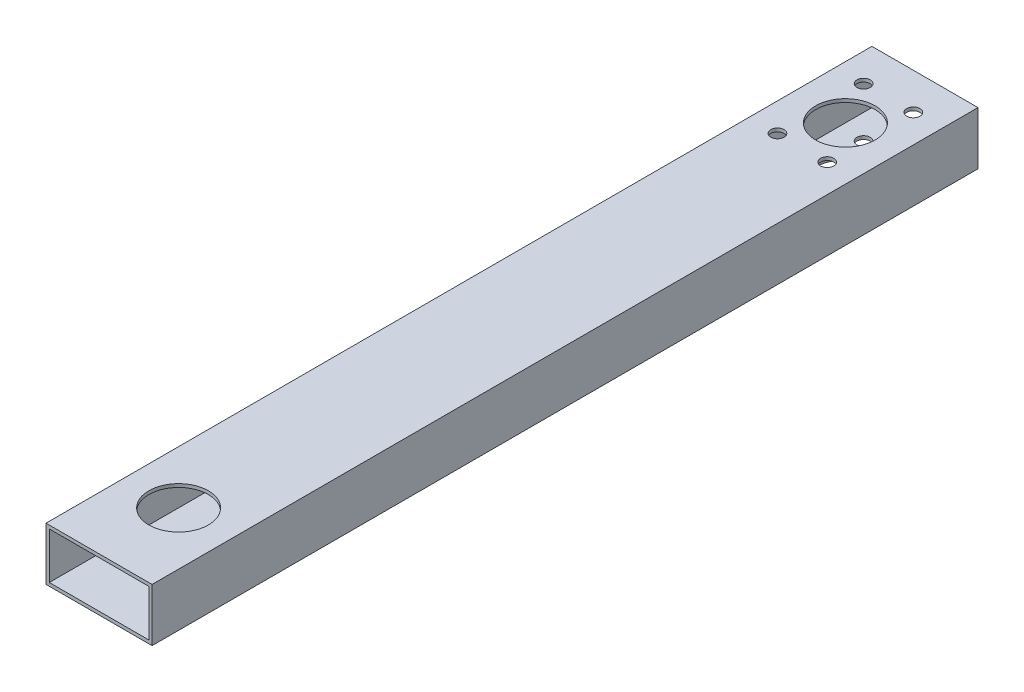
ISO-10303-21;
HEADER;
FILE_DESCRIPTION(('STEP AP214'),'2;1');
FILE_NAME('part.step','',(''),(''),'','','');
FILE_SCHEMA(('AUTOMOTIVE_DESIGN { 1 0 10303 214 1 1 1 1 }'));
ENDSEC;
DATA;
#1=APPLICATION_CONTEXT('core data for automotive mechanical design processes');
#2=APPLICATION_PROTOCOL_DEFINITION('international standard','automotive_design',2000,#1);
#3=PRODUCT_CONTEXT('',#1,'mechanical');
#4=PRODUCT('Part','Part','',(#3));
#5=PRODUCT_RELATED_PRODUCT_CATEGORY('part','',(#4));
#6=PRODUCT_DEFINITION_FORMATION('','',#4);
#7=PRODUCT_DEFINITION_CONTEXT('part definition',#1,'design');
#8=PRODUCT_DEFINITION('design','',#6,#7);
#9=PRODUCT_DEFINITION_SHAPE('','',#8);
#10=(LENGTH_UNIT() NAMED_UNIT(*) SI_UNIT(.MILLI.,.METRE.));
#11=(NAMED_UNIT(*) PLANE_ANGLE_UNIT() SI_UNIT($,.RADIAN.));
#12=(NAMED_UNIT(*) SI_UNIT($,.STERADIAN.) SOLID_ANGLE_UNIT());
#13=UNCERTAINTY_MEASURE_WITH_UNIT(LENGTH_MEASURE(1.E-05),#10,'distance_accuracy_value','');
#14=(GEOMETRIC_REPRESENTATION_CONTEXT(3) GLOBAL_UNCERTAINTY_ASSIGNED_CONTEXT((#13)) GLOBAL_UNIT_ASSIGNED_CONTEXT((#10,
#11,#12)) REPRESENTATION_CONTEXT('',''));
#15=CARTESIAN_POINT('',(0.,0.,0.));
#16=DIRECTION('',(0.,0.,1.));
#17=DIRECTION('',(1.,0.,0.));
#18=AXIS2_PLACEMENT_3D('',#15,#16,#17);
#19=CARTESIAN_POINT('',(0.,0.,395.478));
#20=DIRECTION('',(0.,0.,-1.));
#21=DIRECTION('',(-1.,0.,0.));
#22=AXIS2_PLACEMENT_3D('',#19,#20,#21);
#23=PLANE('',#22);
#24=DIRECTION('',(0.,-1.,0.));
#25=VECTOR('',#24,1.);
#26=CARTESIAN_POINT('',(0.,0.,395.478));
#27=LINE('',#26,#25);
#28=CARTESIAN_POINT('',(0.,25.4,395.478));
#29=VERTEX_POINT('',#28);
#30=CARTESIAN_POINT('',(0.,0.,395.478));
#31=VERTEX_POINT('',#30);
#32=EDGE_CURVE('E148',#29,#31,#27,.T.);
#33=ORIENTED_EDGE('',*,*,#32,.T.);
#34=DIRECTION('',(1.,0.,0.));
#35=VECTOR('',#34,1.);
#36=CARTESIAN_POINT('',(0.,0.,395.478));
#37=LINE('',#36,#35);
#38=CARTESIAN_POINT('',(50.8,0.,395.478));
#39=VERTEX_POINT('',#38);
#40=EDGE_CURVE('E151',#31,#39,#37,.T.);
#41=ORIENTED_EDGE('',*,*,#40,.T.);
#42=DIRECTION('',(0.,1.,0.));
#43=VECTOR('',#42,1.);
#44=CARTESIAN_POINT('',(50.8,0.,395.478));
#45=LINE('',#44,#43);
#46=CARTESIAN_POINT('',(50.8,25.4,395.478));
#47=VERTEX_POINT('',#46);
#48=EDGE_CURVE('E154',#39,#47,#45,.T.);
#49=ORIENTED_EDGE('',*,*,#48,.T.);
#50=DIRECTION('',(-1.,0.,0.));
#51=VECTOR('',#50,1.);
#52=CARTESIAN_POINT('',(0.,25.4,395.478));
#53=LINE('',#52,#51);
#54=EDGE_CURVE('E156',#47,#29,#53,.T.);
#55=ORIENTED_EDGE('',*,*,#54,.T.);
#56=EDGE_LOOP('',(#33,#41,#49,#55));
#57=FACE_BOUND('',#56,.T.);
#58=DIRECTION('',(0.,-1.,0.));
#59=VECTOR('',#58,1.);
#60=CARTESIAN_POINT('',(1.5875,1.5875,395.478));
#61=LINE('',#60,#59);
#62=CARTESIAN_POINT('',(1.5875,23.8125,395.478));
#63=VERTEX_POINT('',#62);
#64=CARTESIAN_POINT('',(1.5875,1.5875,395.478));
#65=VERTEX_POINT('',#64);
#66=EDGE_CURVE('E110',#63,#65,#61,.T.);
#67=ORIENTED_EDGE('',*,*,#66,.F.);
#68=DIRECTION('',(-1.,0.,0.));
#69=VECTOR('',#68,1.);
#70=CARTESIAN_POINT('',(1.5875,23.8125,395.478));
#71=LINE('',#70,#69);
#72=CARTESIAN_POINT('',(49.2125,23.8125,395.478));
#73=VERTEX_POINT('',#72);
#74=EDGE_CURVE('E132',#73,#63,#71,.T.);
#75=ORIENTED_EDGE('',*,*,#74,.F.);
#76=DIRECTION('',(0.,1.,0.));
#77=VECTOR('',#76,1.);
#78=CARTESIAN_POINT('',(49.2125,1.5875,395.478));
#79=LINE('',#78,#77);
#80=CARTESIAN_POINT('',(49.2125,1.5875,395.478));
#81=VERTEX_POINT('',#80);
#82=EDGE_CURVE('E130',#81,#73,#79,.T.);
#83=ORIENTED_EDGE('',*,*,#82,.F.);
#84=DIRECTION('',(1.,0.,0.));
#85=VECTOR('',#84,1.);
#86=CARTESIAN_POINT('',(1.5875,1.5875,395.478));
#87=LINE('',#86,#85);
#88=EDGE_CURVE('E118',#65,#81,#87,.T.);
#89=ORIENTED_EDGE('',*,*,#88,.F.);
#90=EDGE_LOOP('',(#67,#75,#83,#89));
#91=FACE_BOUND('',#90,.T.);
#92=ADVANCED_FACE('F43',(#57,#91),#23,.F.);
#93=CARTESIAN_POINT('',(0.,0.,0.));
#94=DIRECTION('',(0.,0.,-1.));
#95=DIRECTION('',(-1.,0.,0.));
#96=AXIS2_PLACEMENT_3D('',#93,#94,#95);
#97=PLANE('',#96);
#98=DIRECTION('',(0.,-1.,0.));
#99=VECTOR('',#98,1.);
#100=CARTESIAN_POINT('',(0.,0.,0.));
#101=LINE('',#100,#99);
#102=CARTESIAN_POINT('',(0.,25.4,0.));
#103=VERTEX_POINT('',#102);
#104=CARTESIAN_POINT('',(0.,0.,0.));
#105=VERTEX_POINT('',#104);
#106=EDGE_CURVE('E126',#103,#105,#101,.T.);
#107=ORIENTED_EDGE('',*,*,#106,.F.);
#108=DIRECTION('',(-1.,0.,0.));
#109=VECTOR('',#108,1.);
#110=CARTESIAN_POINT('',(0.,25.4,0.));
#111=LINE('',#110,#109);
#112=CARTESIAN_POINT('',(50.8,25.4,0.));
#113=VERTEX_POINT('',#112);
#114=EDGE_CURVE('E152',#113,#103,#111,.T.);
#115=ORIENTED_EDGE('',*,*,#114,.F.);
#116=DIRECTION('',(0.,1.,0.));
#117=VECTOR('',#116,1.);
#118=CARTESIAN_POINT('',(50.8,0.,0.));
#119=LINE('',#118,#117);
#120=CARTESIAN_POINT('',(50.8,0.,0.));
#121=VERTEX_POINT('',#120);
#122=EDGE_CURVE('E163',#121,#113,#119,.T.);
#123=ORIENTED_EDGE('',*,*,#122,.F.);
#124=DIRECTION('',(1.,0.,0.));
#125=VECTOR('',#124,1.);
#126=CARTESIAN_POINT('',(0.,0.,0.));
#127=LINE('',#126,#125);
#128=EDGE_CURVE('E161',#105,#121,#127,.T.);
#129=ORIENTED_EDGE('',*,*,#128,.F.);
#130=EDGE_LOOP('',(#107,#115,#123,#129));
#131=FACE_BOUND('',#130,.T.);
#132=DIRECTION('',(-1.,0.,0.));
#133=VECTOR('',#132,1.);
#134=CARTESIAN_POINT('',(1.5875,23.8125,0.));
#135=LINE('',#134,#133);
#136=CARTESIAN_POINT('',(49.2125,23.8125,0.));
#137=VERTEX_POINT('',#136);
#138=CARTESIAN_POINT('',(1.5875,23.8125,0.));
#139=VERTEX_POINT('',#138);
#140=EDGE_CURVE('E119',#137,#139,#135,.T.);
#141=ORIENTED_EDGE('',*,*,#140,.T.);
#142=DIRECTION('',(0.,-1.,0.));
#143=VECTOR('',#142,1.);
#144=CARTESIAN_POINT('',(1.5875,1.5875,0.));
#145=LINE('',#144,#143);
#146=CARTESIAN_POINT('',(1.5875,1.5875,0.));
#147=VERTEX_POINT('',#146);
#148=EDGE_CURVE('E68',#139,#147,#145,.T.);
#149=ORIENTED_EDGE('',*,*,#148,.T.);
#150=DIRECTION('',(1.,0.,0.));
#151=VECTOR('',#150,1.);
#152=CARTESIAN_POINT('',(1.5875,1.5875,0.));
#153=LINE('',#152,#151);
#154=CARTESIAN_POINT('',(49.2125,1.5875,0.));
#155=VERTEX_POINT('',#154);
#156=EDGE_CURVE('E125',#147,#155,#153,.T.);
#157=ORIENTED_EDGE('',*,*,#156,.T.);
#158=DIRECTION('',(0.,1.,0.));
#159=VECTOR('',#158,1.);
#160=CARTESIAN_POINT('',(49.2125,1.5875,0.));
#161=LINE('',#160,#159);
#162=EDGE_CURVE('E140',#155,#137,#161,.T.);
#163=ORIENTED_EDGE('',*,*,#162,.T.);
#164=EDGE_LOOP('',(#141,#149,#157,#163));
#165=FACE_BOUND('',#164,.T.);
#166=ADVANCED_FACE('F241',(#131,#165),#97,.T.);
#167=CARTESIAN_POINT('',(0.,0.,395.478));
#168=DIRECTION('',(1.,0.,0.));
#169=DIRECTION('',(0.,0.,-1.));
#170=AXIS2_PLACEMENT_3D('',#167,#168,#169);
#171=PLANE('',#170);
#172=ORIENTED_EDGE('',*,*,#106,.T.);
#173=DIRECTION('',(0.,0.,-1.));
#174=VECTOR('',#173,1.);
#175=CARTESIAN_POINT('',(0.,0.,395.478));
#176=LINE('',#175,#174);
#177=EDGE_CURVE('E11',#31,#105,#176,.T.);
#178=ORIENTED_EDGE('',*,*,#177,.F.);
#179=ORIENTED_EDGE('',*,*,#32,.F.);
#180=DIRECTION('',(0.,0.,-1.));
#181=VECTOR('',#180,1.);
#182=CARTESIAN_POINT('',(0.,25.4,395.478));
#183=LINE('',#182,#181);
#184=EDGE_CURVE('E158',#29,#103,#183,.T.);
#185=ORIENTED_EDGE('',*,*,#184,.T.);
#186=EDGE_LOOP('',(#172,#178,#179,#185));
#187=FACE_BOUND('',#186,.T.);
#188=ADVANCED_FACE('F45',(#187),#171,.F.);
#189=CARTESIAN_POINT('',(0.,0.,395.478));
#190=DIRECTION('',(0.,1.,0.));
#191=DIRECTION('',(0.,0.,1.));
#192=AXIS2_PLACEMENT_3D('',#189,#190,#191);
#193=PLANE('',#192);
#194=CARTESIAN_POINT('',(25.4,0.,357.378));
#195=DIRECTION('',(0.,1.,0.));
#196=DIRECTION('',(0.,0.,1.));
#197=AXIS2_PLACEMENT_3D('',#194,#195,#196);
#198=CIRCLE('',#197,14.224);
#199=CARTESIAN_POINT('',(25.4,0.,371.602));
#200=VERTEX_POINT('',#199);
#201=EDGE_CURVE('E268',#200,#200,#198,.T.);
#202=ORIENTED_EDGE('',*,*,#201,.T.);
#203=EDGE_LOOP('',(#202));
#204=FACE_BOUND('',#203,.T.);
#205=CARTESIAN_POINT('',(37.30625,0.,17.4777700723831));
#206=DIRECTION('',(0.,1.,0.));
#207=DIRECTION('',(0.,0.,-1.));
#208=AXIS2_PLACEMENT_3D('',#205,#206,#207);
#209=CIRCLE('',#208,3.175);
#210=CARTESIAN_POINT('',(37.30625,0.,14.3027700723831));
#211=VERTEX_POINT('',#210);
#212=EDGE_CURVE('E272',#211,#211,#209,.T.);
#213=ORIENTED_EDGE('',*,*,#212,.T.);
#214=EDGE_LOOP('',(#213));
#215=FACE_BOUND('',#214,.T.);
#216=CARTESIAN_POINT('',(37.3062499999999,0.,58.722229927617));
#217=DIRECTION('',(0.,1.,0.));
#218=DIRECTION('',(0.,0.,-1.));
#219=AXIS2_PLACEMENT_3D('',#216,#217,#218);
#220=CIRCLE('',#219,3.175);
#221=CARTESIAN_POINT('',(37.3062499999999,0.,55.547229927617));
#222=VERTEX_POINT('',#221);
#223=EDGE_CURVE('E276',#222,#222,#220,.T.);
#224=ORIENTED_EDGE('',*,*,#223,.T.);
#225=EDGE_LOOP('',(#224));
#226=FACE_BOUND('',#225,.T.);
#227=CARTESIAN_POINT('',(13.4937500000001,0.,58.722229927617));
#228=DIRECTION('',(0.,1.,0.));
#229=DIRECTION('',(0.,0.,1.));
#230=AXIS2_PLACEMENT_3D('',#227,#228,#229);
#231=CIRCLE('',#230,3.175);
#232=CARTESIAN_POINT('',(13.4937500000001,0.,61.897229927617));
#233=VERTEX_POINT('',#232);
#234=EDGE_CURVE('E280',#233,#233,#231,.T.);
#235=ORIENTED_EDGE('',*,*,#234,.T.);
#236=EDGE_LOOP('',(#235));
#237=FACE_BOUND('',#236,.T.);
#238=CARTESIAN_POINT('',(13.49375,0.,17.4777700723831));
#239=DIRECTION('',(0.,1.,0.));
#240=DIRECTION('',(0.,0.,1.));
#241=AXIS2_PLACEMENT_3D('',#238,#239,#240);
#242=CIRCLE('',#241,3.175);
#243=CARTESIAN_POINT('',(13.49375,0.,20.6527700723831));
#244=VERTEX_POINT('',#243);
#245=EDGE_CURVE('E284',#244,#244,#242,.T.);
#246=ORIENTED_EDGE('',*,*,#245,.T.);
#247=EDGE_LOOP('',(#246));
#248=FACE_BOUND('',#247,.T.);
#249=CARTESIAN_POINT('',(25.4,0.,38.1));
#250=DIRECTION('',(0.,1.,0.));
#251=DIRECTION('',(0.,0.,1.));
#252=AXIS2_PLACEMENT_3D('',#249,#250,#251);
#253=CIRCLE('',#252,14.224);
#254=CARTESIAN_POINT('',(25.4,0.,52.324));
#255=VERTEX_POINT('',#254);
#256=EDGE_CURVE('E177',#255,#255,#253,.T.);
#257=ORIENTED_EDGE('',*,*,#256,.T.);
#258=EDGE_LOOP('',(#257));
#259=FACE_BOUND('',#258,.T.);
#260=ORIENTED_EDGE('',*,*,#128,.T.);
#261=DIRECTION('',(0.,0.,-1.));
#262=VECTOR('',#261,1.);
#263=CARTESIAN_POINT('',(50.8,0.,395.478));
#264=LINE('',#263,#262);
#265=EDGE_CURVE('E52',#39,#121,#264,.T.);
#266=ORIENTED_EDGE('',*,*,#265,.F.);
#267=ORIENTED_EDGE('',*,*,#40,.F.);
#268=ORIENTED_EDGE('',*,*,#177,.T.);
#269=EDGE_LOOP('',(#260,#266,#267,#268));
#270=FACE_BOUND('',#269,.T.);
#271=ADVANCED_FACE('F256',(#204,#215,#226,#237,#248,#259,#270),#193,.F.);
#272=CARTESIAN_POINT('',(50.8,0.,395.478));
#273=DIRECTION('',(-1.,0.,0.));
#274=DIRECTION('',(0.,0.,1.));
#275=AXIS2_PLACEMENT_3D('',#272,#273,#274);
#276=PLANE('',#275);
#277=ORIENTED_EDGE('',*,*,#122,.T.);
#278=DIRECTION('',(0.,0.,-1.));
#279=VECTOR('',#278,1.);
#280=CARTESIAN_POINT('',(50.8,25.4,395.478));
#281=LINE('',#280,#279);
#282=EDGE_CURVE('E168',#47,#113,#281,.T.);
#283=ORIENTED_EDGE('',*,*,#282,.F.);
#284=ORIENTED_EDGE('',*,*,#48,.F.);
#285=ORIENTED_EDGE('',*,*,#265,.T.);
#286=EDGE_LOOP('',(#277,#283,#284,#285));
#287=FACE_BOUND('',#286,.T.);
#288=ADVANCED_FACE('F254',(#287),#276,.F.);
#289=CARTESIAN_POINT('',(0.,25.4,395.478));
#290=DIRECTION('',(0.,-1.,0.));
#291=DIRECTION('',(0.,0.,-1.));
#292=AXIS2_PLACEMENT_3D('',#289,#290,#291);
#293=PLANE('',#292);
#294=CARTESIAN_POINT('',(25.4,25.4,357.378));
#295=DIRECTION('',(0.,-1.,0.));
#296=DIRECTION('',(0.,0.,-1.));
#297=AXIS2_PLACEMENT_3D('',#294,#295,#296);
#298=CIRCLE('',#297,14.224);
#299=CARTESIAN_POINT('',(25.4,25.4,343.154));
#300=VERTEX_POINT('',#299);
#301=EDGE_CURVE('E138',#300,#300,#298,.T.);
#302=ORIENTED_EDGE('',*,*,#301,.T.);
#303=EDGE_LOOP('',(#302));
#304=FACE_BOUND('',#303,.T.);
#305=CARTESIAN_POINT('',(37.30625,25.4,17.4777700723831));
#306=DIRECTION('',(0.,-1.,0.));
#307=DIRECTION('',(0.,0.,-1.));
#308=AXIS2_PLACEMENT_3D('',#305,#306,#307);
#309=CIRCLE('',#308,3.175);
#310=CARTESIAN_POINT('',(37.30625,25.4,14.3027700723831));
#311=VERTEX_POINT('',#310);
#312=EDGE_CURVE('E199',#311,#311,#309,.T.);
#313=ORIENTED_EDGE('',*,*,#312,.T.);
#314=EDGE_LOOP('',(#313));
#315=FACE_BOUND('',#314,.T.);
#316=CARTESIAN_POINT('',(37.3062499999999,25.4,58.722229927617));
#317=DIRECTION('',(0.,-1.,0.));
#318=DIRECTION('',(0.,0.,-1.));
#319=AXIS2_PLACEMENT_3D('',#316,#317,#318);
#320=CIRCLE('',#319,3.175);
#321=CARTESIAN_POINT('',(37.3062499999999,25.4,55.547229927617));
#322=VERTEX_POINT('',#321);
#323=EDGE_CURVE('E195',#322,#322,#320,.T.);
#324=ORIENTED_EDGE('',*,*,#323,.T.);
#325=EDGE_LOOP('',(#324));
#326=FACE_BOUND('',#325,.T.);
#327=CARTESIAN_POINT('',(13.4937500000001,25.4,58.722229927617));
#328=DIRECTION('',(0.,-1.,0.));
#329=DIRECTION('',(0.,0.,-1.));
#330=AXIS2_PLACEMENT_3D('',#327,#328,#329);
#331=CIRCLE('',#330,3.175);
#332=CARTESIAN_POINT('',(13.4937500000001,25.4,55.547229927617));
#333=VERTEX_POINT('',#332);
#334=EDGE_CURVE('E191',#333,#333,#331,.T.);
#335=ORIENTED_EDGE('',*,*,#334,.T.);
#336=EDGE_LOOP('',(#335));
#337=FACE_BOUND('',#336,.T.);
#338=CARTESIAN_POINT('',(13.49375,25.4,17.4777700723831));
#339=DIRECTION('',(0.,-1.,0.));
#340=DIRECTION('',(0.,0.,-1.));
#341=AXIS2_PLACEMENT_3D('',#338,#339,#340);
#342=CIRCLE('',#341,3.175);
#343=CARTESIAN_POINT('',(13.49375,25.4,14.3027700723831));
#344=VERTEX_POINT('',#343);
#345=EDGE_CURVE('E187',#344,#344,#342,.T.);
#346=ORIENTED_EDGE('',*,*,#345,.T.);
#347=EDGE_LOOP('',(#346));
#348=FACE_BOUND('',#347,.T.);
#349=CARTESIAN_POINT('',(25.4,25.4,38.1));
#350=DIRECTION('',(0.,-1.,0.));
#351=DIRECTION('',(0.,0.,-1.));
#352=AXIS2_PLACEMENT_3D('',#349,#350,#351);
#353=CIRCLE('',#352,14.224);
#354=CARTESIAN_POINT('',(25.4,25.4,23.876));
#355=VERTEX_POINT('',#354);
#356=EDGE_CURVE('E182',#355,#355,#353,.T.);
#357=ORIENTED_EDGE('',*,*,#356,.T.);
#358=EDGE_LOOP('',(#357));
#359=FACE_BOUND('',#358,.T.);
#360=ORIENTED_EDGE('',*,*,#114,.T.);
#361=ORIENTED_EDGE('',*,*,#184,.F.);
#362=ORIENTED_EDGE('',*,*,#54,.F.);
#363=ORIENTED_EDGE('',*,*,#282,.T.);
#364=EDGE_LOOP('',(#360,#361,#362,#363));
#365=FACE_BOUND('',#364,.T.);
#366=ADVANCED_FACE('F216',(#304,#315,#326,#337,#348,#359,#365),#293,.F.);
#367=CARTESIAN_POINT('',(1.5875,1.5875,395.478));
#368=DIRECTION('',(1.,0.,0.));
#369=DIRECTION('',(0.,0.,-1.));
#370=AXIS2_PLACEMENT_3D('',#367,#368,#369);
#371=PLANE('',#370);
#372=ORIENTED_EDGE('',*,*,#148,.F.);
#373=DIRECTION('',(0.,0.,-1.));
#374=VECTOR('',#373,1.);
#375=CARTESIAN_POINT('',(1.5875,23.8125,395.478));
#376=LINE('',#375,#374);
#377=EDGE_CURVE('E114',#63,#139,#376,.T.);
#378=ORIENTED_EDGE('',*,*,#377,.F.);
#379=ORIENTED_EDGE('',*,*,#66,.T.);
#380=DIRECTION('',(0.,0.,-1.));
#381=VECTOR('',#380,1.);
#382=CARTESIAN_POINT('',(1.5875,1.5875,395.478));
#383=LINE('',#382,#381);
#384=EDGE_CURVE('E113',#65,#147,#383,.T.);
#385=ORIENTED_EDGE('',*,*,#384,.T.);
#386=EDGE_LOOP('',(#372,#378,#379,#385));
#387=FACE_BOUND('',#386,.T.);
#388=ADVANCED_FACE('F112',(#387),#371,.T.);
#389=CARTESIAN_POINT('',(1.5875,1.5875,395.478));
#390=DIRECTION('',(0.,1.,0.));
#391=DIRECTION('',(0.,0.,1.));
#392=AXIS2_PLACEMENT_3D('',#389,#390,#391);
#393=PLANE('',#392);
#394=CARTESIAN_POINT('',(25.4,1.5875,357.378));
#395=DIRECTION('',(0.,1.,0.));
#396=DIRECTION('',(0.,0.,1.));
#397=AXIS2_PLACEMENT_3D('',#394,#395,#396);
#398=CIRCLE('',#397,14.224);
#399=CARTESIAN_POINT('',(25.4,1.5875,371.602));
#400=VERTEX_POINT('',#399);
#401=EDGE_CURVE('E211',#400,#400,#398,.T.);
#402=ORIENTED_EDGE('',*,*,#401,.F.);
#403=EDGE_LOOP('',(#402));
#404=FACE_BOUND('',#403,.T.);
#405=CARTESIAN_POINT('',(37.30625,1.5875,17.4777700723831));
#406=DIRECTION('',(0.,1.,0.));
#407=DIRECTION('',(0.,0.,1.));
#408=AXIS2_PLACEMENT_3D('',#405,#406,#407);
#409=CIRCLE('',#408,3.175);
#410=CARTESIAN_POINT('',(37.30625,1.5875,20.6527700723831));
#411=VERTEX_POINT('',#410);
#412=EDGE_CURVE('E194',#411,#411,#409,.T.);
#413=ORIENTED_EDGE('',*,*,#412,.F.);
#414=EDGE_LOOP('',(#413));
#415=FACE_BOUND('',#414,.T.);
#416=CARTESIAN_POINT('',(37.3062499999999,1.5875,58.722229927617));
#417=DIRECTION('',(0.,1.,0.));
#418=DIRECTION('',(0.,0.,1.));
#419=AXIS2_PLACEMENT_3D('',#416,#417,#418);
#420=CIRCLE('',#419,3.175);
#421=CARTESIAN_POINT('',(37.3062499999999,1.5875,61.897229927617));
#422=VERTEX_POINT('',#421);
#423=EDGE_CURVE('E190',#422,#422,#420,.T.);
#424=ORIENTED_EDGE('',*,*,#423,.F.);
#425=EDGE_LOOP('',(#424));
#426=FACE_BOUND('',#425,.T.);
#427=CARTESIAN_POINT('',(13.4937500000001,1.5875,58.722229927617));
#428=DIRECTION('',(0.,1.,0.));
#429=DIRECTION('',(0.,0.,1.));
#430=AXIS2_PLACEMENT_3D('',#427,#428,#429);
#431=CIRCLE('',#430,3.175);
#432=CARTESIAN_POINT('',(13.4937500000001,1.5875,61.897229927617));
#433=VERTEX_POINT('',#432);
#434=EDGE_CURVE('E186',#433,#433,#431,.T.);
#435=ORIENTED_EDGE('',*,*,#434,.F.);
#436=EDGE_LOOP('',(#435));
#437=FACE_BOUND('',#436,.T.);
#438=CARTESIAN_POINT('',(13.49375,1.5875,17.4777700723831));
#439=DIRECTION('',(0.,1.,0.));
#440=DIRECTION('',(0.,0.,1.));
#441=AXIS2_PLACEMENT_3D('',#438,#439,#440);
#442=CIRCLE('',#441,3.175);
#443=CARTESIAN_POINT('',(13.49375,1.5875,20.6527700723831));
#444=VERTEX_POINT('',#443);
#445=EDGE_CURVE('E181',#444,#444,#442,.T.);
#446=ORIENTED_EDGE('',*,*,#445,.F.);
#447=EDGE_LOOP('',(#446));
#448=FACE_BOUND('',#447,.T.);
#449=CARTESIAN_POINT('',(25.4,1.5875,38.1));
#450=DIRECTION('',(0.,1.,0.));
#451=DIRECTION('',(0.,0.,1.));
#452=AXIS2_PLACEMENT_3D('',#449,#450,#451);
#453=CIRCLE('',#452,14.224);
#454=CARTESIAN_POINT('',(25.4,1.5875,52.324));
#455=VERTEX_POINT('',#454);
#456=EDGE_CURVE('E176',#455,#455,#453,.T.);
#457=ORIENTED_EDGE('',*,*,#456,.F.);
#458=EDGE_LOOP('',(#457));
#459=FACE_BOUND('',#458,.T.);
#460=ORIENTED_EDGE('',*,*,#156,.F.);
#461=ORIENTED_EDGE('',*,*,#384,.F.);
#462=ORIENTED_EDGE('',*,*,#88,.T.);
#463=DIRECTION('',(0.,0.,-1.));
#464=VECTOR('',#463,1.);
#465=CARTESIAN_POINT('',(49.2125,1.5875,395.478));
#466=LINE('',#465,#464);
#467=EDGE_CURVE('E127',#81,#155,#466,.T.);
#468=ORIENTED_EDGE('',*,*,#467,.T.);
#469=EDGE_LOOP('',(#460,#461,#462,#468));
#470=FACE_BOUND('',#469,.T.);
#471=ADVANCED_FACE('F122',(#404,#415,#426,#437,#448,#459,#470),#393,.T.);
#472=CARTESIAN_POINT('',(49.2125,1.5875,395.478));
#473=DIRECTION('',(-1.,0.,0.));
#474=DIRECTION('',(0.,0.,1.));
#475=AXIS2_PLACEMENT_3D('',#472,#473,#474);
#476=PLANE('',#475);
#477=ORIENTED_EDGE('',*,*,#162,.F.);
#478=ORIENTED_EDGE('',*,*,#467,.F.);
#479=ORIENTED_EDGE('',*,*,#82,.T.);
#480=DIRECTION('',(0.,0.,-1.));
#481=VECTOR('',#480,1.);
#482=CARTESIAN_POINT('',(49.2125,23.8125,395.478));
#483=LINE('',#482,#481);
#484=EDGE_CURVE('E60',#73,#137,#483,.T.);
#485=ORIENTED_EDGE('',*,*,#484,.T.);
#486=EDGE_LOOP('',(#477,#478,#479,#485));
#487=FACE_BOUND('',#486,.T.);
#488=ADVANCED_FACE('F303',(#487),#476,.T.);
#489=CARTESIAN_POINT('',(1.5875,23.8125,395.478));
#490=DIRECTION('',(0.,-1.,0.));
#491=DIRECTION('',(0.,0.,-1.));
#492=AXIS2_PLACEMENT_3D('',#489,#490,#491);
#493=PLANE('',#492);
#494=CARTESIAN_POINT('',(25.4,23.8125,357.378));
#495=DIRECTION('',(0.,-1.,0.));
#496=DIRECTION('',(0.,0.,-1.));
#497=AXIS2_PLACEMENT_3D('',#494,#495,#496);
#498=CIRCLE('',#497,14.224);
#499=CARTESIAN_POINT('',(25.4,23.8125,343.154));
#500=VERTEX_POINT('',#499);
#501=EDGE_CURVE('E47',#500,#500,#498,.T.);
#502=ORIENTED_EDGE('',*,*,#501,.F.);
#503=EDGE_LOOP('',(#502));
#504=FACE_BOUND('',#503,.T.);
#505=CARTESIAN_POINT('',(37.30625,23.8125,17.4777700723831));
#506=DIRECTION('',(0.,-1.,0.));
#507=DIRECTION('',(0.,0.,-1.));
#508=AXIS2_PLACEMENT_3D('',#505,#506,#507);
#509=CIRCLE('',#508,3.175);
#510=CARTESIAN_POINT('',(37.30625,23.8125,14.3027700723831));
#511=VERTEX_POINT('',#510);
#512=EDGE_CURVE('E192',#511,#511,#509,.T.);
#513=ORIENTED_EDGE('',*,*,#512,.F.);
#514=EDGE_LOOP('',(#513));
#515=FACE_BOUND('',#514,.T.);
#516=CARTESIAN_POINT('',(37.3062499999999,23.8125,58.722229927617));
#517=DIRECTION('',(0.,-1.,0.));
#518=DIRECTION('',(0.,0.,-1.));
#519=AXIS2_PLACEMENT_3D('',#516,#517,#518);
#520=CIRCLE('',#519,3.175);
#521=CARTESIAN_POINT('',(37.3062499999999,23.8125,55.547229927617));
#522=VERTEX_POINT('',#521);
#523=EDGE_CURVE('E188',#522,#522,#520,.T.);
#524=ORIENTED_EDGE('',*,*,#523,.F.);
#525=EDGE_LOOP('',(#524));
#526=FACE_BOUND('',#525,.T.);
#527=CARTESIAN_POINT('',(13.4937500000001,23.8125,58.722229927617));
#528=DIRECTION('',(0.,-1.,0.));
#529=DIRECTION('',(0.,0.,-1.));
#530=AXIS2_PLACEMENT_3D('',#527,#528,#529);
#531=CIRCLE('',#530,3.175);
#532=CARTESIAN_POINT('',(13.4937500000001,23.8125,55.547229927617));
#533=VERTEX_POINT('',#532);
#534=EDGE_CURVE('E183',#533,#533,#531,.T.);
#535=ORIENTED_EDGE('',*,*,#534,.F.);
#536=EDGE_LOOP('',(#535));
#537=FACE_BOUND('',#536,.T.);
#538=CARTESIAN_POINT('',(13.49375,23.8125,17.4777700723831));
#539=DIRECTION('',(0.,-1.,0.));
#540=DIRECTION('',(0.,0.,-1.));
#541=AXIS2_PLACEMENT_3D('',#538,#539,#540);
#542=CIRCLE('',#541,3.175);
#543=CARTESIAN_POINT('',(13.49375,23.8125,14.3027700723831));
#544=VERTEX_POINT('',#543);
#545=EDGE_CURVE('E178',#544,#544,#542,.T.);
#546=ORIENTED_EDGE('',*,*,#545,.F.);
#547=EDGE_LOOP('',(#546));
#548=FACE_BOUND('',#547,.T.);
#549=CARTESIAN_POINT('',(25.4,23.8125,38.1));
#550=DIRECTION('',(0.,-1.,0.));
#551=DIRECTION('',(0.,0.,-1.));
#552=AXIS2_PLACEMENT_3D('',#549,#550,#551);
#553=CIRCLE('',#552,14.224);
#554=CARTESIAN_POINT('',(25.4,23.8125,23.876));
#555=VERTEX_POINT('',#554);
#556=EDGE_CURVE('E173',#555,#555,#553,.T.);
#557=ORIENTED_EDGE('',*,*,#556,.F.);
#558=EDGE_LOOP('',(#557));
#559=FACE_BOUND('',#558,.T.);
#560=ORIENTED_EDGE('',*,*,#140,.F.);
#561=ORIENTED_EDGE('',*,*,#484,.F.);
#562=ORIENTED_EDGE('',*,*,#74,.T.);
#563=ORIENTED_EDGE('',*,*,#377,.T.);
#564=EDGE_LOOP('',(#560,#561,#562,#563));
#565=FACE_BOUND('',#564,.T.);
#566=ADVANCED_FACE('F301',(#504,#515,#526,#537,#548,#559,#565),#493,.T.);
#567=CARTESIAN_POINT('',(25.4,0.,38.1));
#568=DIRECTION('',(0.,1.,0.));
#569=DIRECTION('',(0.,0.,1.));
#570=AXIS2_PLACEMENT_3D('',#567,#568,#569);
#571=CYLINDRICAL_SURFACE('',#570,14.224);
#572=ORIENTED_EDGE('',*,*,#556,.T.);
#573=EDGE_LOOP('',(#572));
#574=FACE_BOUND('',#573,.T.);
#575=ORIENTED_EDGE('',*,*,#356,.F.);
#576=EDGE_LOOP('',(#575));
#577=FACE_BOUND('',#576,.T.);
#578=ADVANCED_FACE('F233',(#574,#577),#571,.F.);
#579=CARTESIAN_POINT('',(13.49375,0.,17.4777700723831));
#580=DIRECTION('',(0.,1.,0.));
#581=DIRECTION('',(0.,0.,1.));
#582=AXIS2_PLACEMENT_3D('',#579,#580,#581);
#583=CYLINDRICAL_SURFACE('',#582,3.175);
#584=ORIENTED_EDGE('',*,*,#545,.T.);
#585=EDGE_LOOP('',(#584));
#586=FACE_BOUND('',#585,.T.);
#587=ORIENTED_EDGE('',*,*,#345,.F.);
#588=EDGE_LOOP('',(#587));
#589=FACE_BOUND('',#588,.T.);
#590=ADVANCED_FACE('F310',(#586,#589),#583,.F.);
#591=CARTESIAN_POINT('',(13.4937500000001,0.,58.722229927617));
#592=DIRECTION('',(0.,1.,0.));
#593=DIRECTION('',(0.,0.,1.));
#594=AXIS2_PLACEMENT_3D('',#591,#592,#593);
#595=CYLINDRICAL_SURFACE('',#594,3.175);
#596=ORIENTED_EDGE('',*,*,#534,.T.);
#597=EDGE_LOOP('',(#596));
#598=FACE_BOUND('',#597,.T.);
#599=ORIENTED_EDGE('',*,*,#334,.F.);
#600=EDGE_LOOP('',(#599));
#601=FACE_BOUND('',#600,.T.);
#602=ADVANCED_FACE('F348',(#598,#601),#595,.F.);
#603=CARTESIAN_POINT('',(37.3062499999999,0.,58.722229927617));
#604=DIRECTION('',(0.,1.,0.));
#605=DIRECTION('',(0.,0.,1.));
#606=AXIS2_PLACEMENT_3D('',#603,#604,#605);
#607=CYLINDRICAL_SURFACE('',#606,3.175);
#608=ORIENTED_EDGE('',*,*,#523,.T.);
#609=EDGE_LOOP('',(#608));
#610=FACE_BOUND('',#609,.T.);
#611=ORIENTED_EDGE('',*,*,#323,.F.);
#612=EDGE_LOOP('',(#611));
#613=FACE_BOUND('',#612,.T.);
#614=ADVANCED_FACE('F234',(#610,#613),#607,.F.);
#615=CARTESIAN_POINT('',(37.30625,0.,17.4777700723831));
#616=DIRECTION('',(0.,1.,0.));
#617=DIRECTION('',(0.,0.,1.));
#618=AXIS2_PLACEMENT_3D('',#615,#616,#617);
#619=CYLINDRICAL_SURFACE('',#618,3.175);
#620=ORIENTED_EDGE('',*,*,#512,.T.);
#621=EDGE_LOOP('',(#620));
#622=FACE_BOUND('',#621,.T.);
#623=ORIENTED_EDGE('',*,*,#312,.F.);
#624=EDGE_LOOP('',(#623));
#625=FACE_BOUND('',#624,.T.);
#626=ADVANCED_FACE('F222',(#622,#625),#619,.F.);
#627=CARTESIAN_POINT('',(25.4,0.,357.378));
#628=DIRECTION('',(0.,1.,0.));
#629=DIRECTION('',(0.,0.,1.));
#630=AXIS2_PLACEMENT_3D('',#627,#628,#629);
#631=CYLINDRICAL_SURFACE('',#630,14.224);
#632=ORIENTED_EDGE('',*,*,#501,.T.);
#633=EDGE_LOOP('',(#632));
#634=FACE_BOUND('',#633,.T.);
#635=ORIENTED_EDGE('',*,*,#301,.F.);
#636=EDGE_LOOP('',(#635));
#637=FACE_BOUND('',#636,.T.);
#638=ADVANCED_FACE('F219',(#634,#637),#631,.F.);
#639=ORIENTED_EDGE('',*,*,#456,.T.);
#640=EDGE_LOOP('',(#639));
#641=FACE_BOUND('',#640,.T.);
#642=ORIENTED_EDGE('',*,*,#256,.F.);
#643=EDGE_LOOP('',(#642));
#644=FACE_BOUND('',#643,.T.);
#645=ADVANCED_FACE('F221',(#641,#644),#571,.F.);
#646=ORIENTED_EDGE('',*,*,#445,.T.);
#647=EDGE_LOOP('',(#646));
#648=FACE_BOUND('',#647,.T.);
#649=ORIENTED_EDGE('',*,*,#245,.F.);
#650=EDGE_LOOP('',(#649));
#651=FACE_BOUND('',#650,.T.);
#652=ADVANCED_FACE('F230',(#648,#651),#583,.F.);
#653=ORIENTED_EDGE('',*,*,#434,.T.);
#654=EDGE_LOOP('',(#653));
#655=FACE_BOUND('',#654,.T.);
#656=ORIENTED_EDGE('',*,*,#234,.F.);
#657=EDGE_LOOP('',(#656));
#658=FACE_BOUND('',#657,.T.);
#659=ADVANCED_FACE('F352',(#655,#658),#595,.F.);
#660=ORIENTED_EDGE('',*,*,#423,.T.);
#661=EDGE_LOOP('',(#660));
#662=FACE_BOUND('',#661,.T.);
#663=ORIENTED_EDGE('',*,*,#223,.F.);
#664=EDGE_LOOP('',(#663));
#665=FACE_BOUND('',#664,.T.);
#666=ADVANCED_FACE('F359',(#662,#665),#607,.F.);
#667=ORIENTED_EDGE('',*,*,#412,.T.);
#668=EDGE_LOOP('',(#667));
#669=FACE_BOUND('',#668,.T.);
#670=ORIENTED_EDGE('',*,*,#212,.F.);
#671=EDGE_LOOP('',(#670));
#672=FACE_BOUND('',#671,.T.);
#673=ADVANCED_FACE('F236',(#669,#672),#619,.F.);
#674=ORIENTED_EDGE('',*,*,#401,.T.);
#675=EDGE_LOOP('',(#674));
#676=FACE_BOUND('',#675,.T.);
#677=ORIENTED_EDGE('',*,*,#201,.F.);
#678=EDGE_LOOP('',(#677));
#679=FACE_BOUND('',#678,.T.);
#680=ADVANCED_FACE('F225',(#676,#679),#631,.F.);
#681=CLOSED_SHELL('',(#92,#166,#188,#271,#288,#366,#388,#471,#488,#566,#578,#590,#602,#614,#626,
#638,#645,#652,#659,#666,#673,#680));
#682=MANIFOLD_SOLID_BREP('B2',#681);
#683=ADVANCED_BREP_SHAPE_REPRESENTATION('',(#18,#682),#14);
#684=SHAPE_DEFINITION_REPRESENTATION(#9,#683);
ENDSEC;
END-ISO-10303-21;
